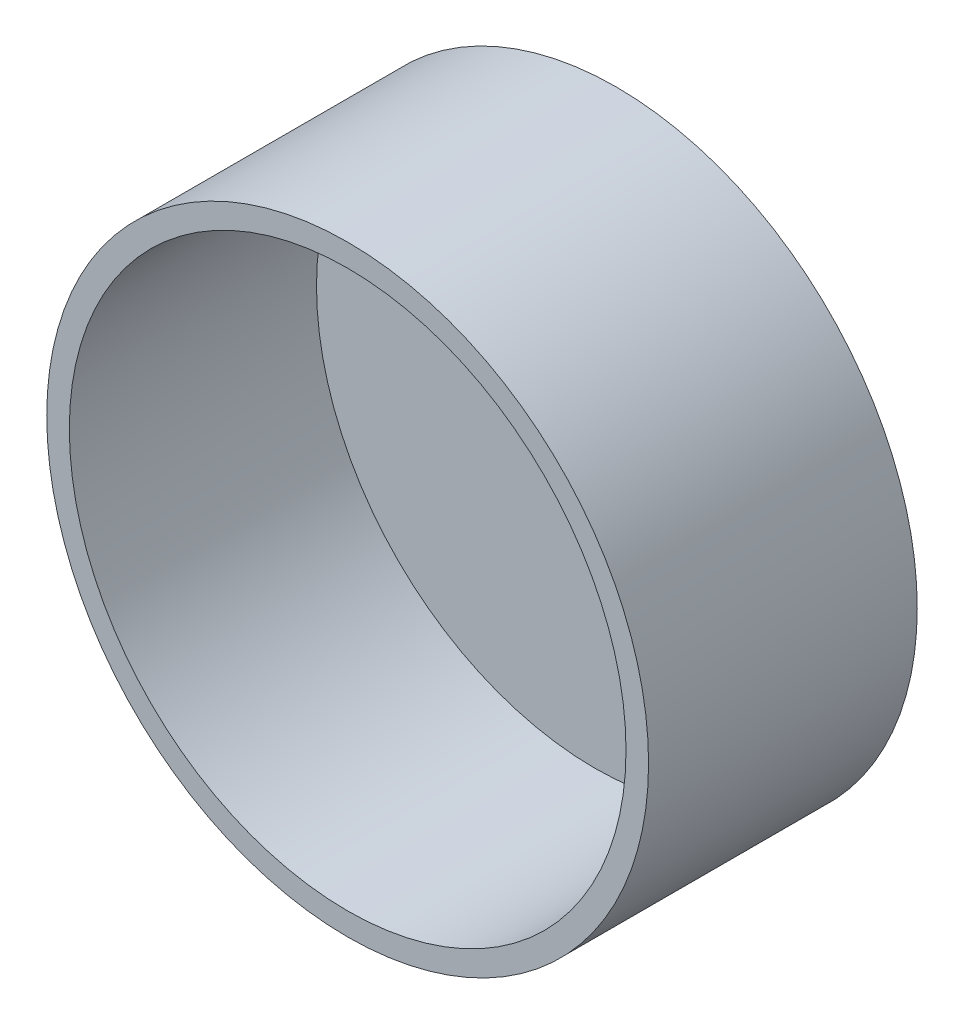
ISO-10303-21;
HEADER;
FILE_DESCRIPTION(('STEP AP214'),'2;1');
FILE_NAME('part.step','',(''),(''),'','','');
FILE_SCHEMA(('AUTOMOTIVE_DESIGN { 1 0 10303 214 1 1 1 1 }'));
ENDSEC;
DATA;
#1=APPLICATION_CONTEXT('core data for automotive mechanical design processes');
#2=APPLICATION_PROTOCOL_DEFINITION('international standard','automotive_design',2000,#1);
#3=PRODUCT_CONTEXT('',#1,'mechanical');
#4=PRODUCT('Part','Part','',(#3));
#5=PRODUCT_RELATED_PRODUCT_CATEGORY('part','',(#4));
#6=PRODUCT_DEFINITION_FORMATION('','',#4);
#7=PRODUCT_DEFINITION_CONTEXT('part definition',#1,'design');
#8=PRODUCT_DEFINITION('design','',#6,#7);
#9=PRODUCT_DEFINITION_SHAPE('','',#8);
#10=(LENGTH_UNIT() NAMED_UNIT(*) SI_UNIT(.MILLI.,.METRE.));
#11=(NAMED_UNIT(*) PLANE_ANGLE_UNIT() SI_UNIT($,.RADIAN.));
#12=(NAMED_UNIT(*) SI_UNIT($,.STERADIAN.) SOLID_ANGLE_UNIT());
#13=UNCERTAINTY_MEASURE_WITH_UNIT(LENGTH_MEASURE(1.E-05),#10,'distance_accuracy_value','');
#14=(GEOMETRIC_REPRESENTATION_CONTEXT(3) GLOBAL_UNCERTAINTY_ASSIGNED_CONTEXT((#13)) GLOBAL_UNIT_ASSIGNED_CONTEXT((#10,
#11,#12)) REPRESENTATION_CONTEXT('',''));
#15=CARTESIAN_POINT('',(0.,0.,0.));
#16=DIRECTION('',(0.,0.,1.));
#17=DIRECTION('',(1.,0.,0.));
#18=AXIS2_PLACEMENT_3D('',#15,#16,#17);
#19=CARTESIAN_POINT('',(0.,0.,1.));
#20=DIRECTION('',(0.,0.,-1.));
#21=DIRECTION('',(-1.,0.,0.));
#22=AXIS2_PLACEMENT_3D('',#19,#20,#21);
#23=CYLINDRICAL_SURFACE('',#22,14.);
#24=CARTESIAN_POINT('',(0.,0.,0.));
#25=DIRECTION('',(0.,0.,1.));
#26=DIRECTION('',(1.,0.,0.));
#27=AXIS2_PLACEMENT_3D('',#24,#25,#26);
#28=CIRCLE('',#27,14.);
#29=CARTESIAN_POINT('',(14.,0.,0.));
#30=VERTEX_POINT('',#29);
#31=EDGE_CURVE('E35',#30,#30,#28,.T.);
#32=ORIENTED_EDGE('',*,*,#31,.T.);
#33=EDGE_LOOP('',(#32));
#34=FACE_BOUND('',#33,.T.);
#35=CARTESIAN_POINT('',(0.,0.,12.5));
#36=DIRECTION('',(0.,0.,1.));
#37=DIRECTION('',(1.,0.,0.));
#38=AXIS2_PLACEMENT_3D('',#35,#36,#37);
#39=CIRCLE('',#38,14.);
#40=CARTESIAN_POINT('',(14.,0.,12.5));
#41=VERTEX_POINT('',#40);
#42=EDGE_CURVE('E39',#41,#41,#39,.T.);
#43=ORIENTED_EDGE('',*,*,#42,.F.);
#44=EDGE_LOOP('',(#43));
#45=FACE_BOUND('',#44,.T.);
#46=ADVANCED_FACE('F29',(#34,#45),#23,.T.);
#47=CARTESIAN_POINT('',(0.,0.,0.));
#48=DIRECTION('',(0.,0.,1.));
#49=DIRECTION('',(1.,0.,0.));
#50=AXIS2_PLACEMENT_3D('',#47,#48,#49);
#51=PLANE('',#50);
#52=ORIENTED_EDGE('',*,*,#31,.F.);
#53=EDGE_LOOP('',(#52));
#54=FACE_BOUND('',#53,.T.);
#55=ADVANCED_FACE('F53',(#54),#51,.F.);
#56=CARTESIAN_POINT('',(0.,0.,12.5));
#57=DIRECTION('',(0.,0.,1.));
#58=DIRECTION('',(1.,0.,0.));
#59=AXIS2_PLACEMENT_3D('',#56,#57,#58);
#60=PLANE('',#59);
#61=ORIENTED_EDGE('',*,*,#42,.T.);
#62=EDGE_LOOP('',(#61));
#63=FACE_BOUND('',#62,.T.);
#64=CARTESIAN_POINT('',(0.,0.,12.5));
#65=DIRECTION('',(0.,0.,1.));
#66=DIRECTION('',(1.,0.,0.));
#67=AXIS2_PLACEMENT_3D('',#64,#65,#66);
#68=CIRCLE('',#67,12.95);
#69=CARTESIAN_POINT('',(12.95,0.,12.5));
#70=VERTEX_POINT('',#69);
#71=EDGE_CURVE('E43',#70,#70,#68,.T.);
#72=ORIENTED_EDGE('',*,*,#71,.F.);
#73=EDGE_LOOP('',(#72));
#74=FACE_BOUND('',#73,.T.);
#75=ADVANCED_FACE('F51',(#63,#74),#60,.T.);
#76=CARTESIAN_POINT('',(0.,0.,12.5));
#77=DIRECTION('',(0.,0.,-1.));
#78=DIRECTION('',(-1.,0.,0.));
#79=AXIS2_PLACEMENT_3D('',#76,#77,#78);
#80=CYLINDRICAL_SURFACE('',#79,12.95);
#81=ORIENTED_EDGE('',*,*,#71,.T.);
#82=EDGE_LOOP('',(#81));
#83=FACE_BOUND('',#82,.T.);
#84=CARTESIAN_POINT('',(0.,0.,1.));
#85=DIRECTION('',(0.,0.,1.));
#86=DIRECTION('',(1.,0.,0.));
#87=AXIS2_PLACEMENT_3D('',#84,#85,#86);
#88=CIRCLE('',#87,12.95);
#89=CARTESIAN_POINT('',(12.95,0.,1.));
#90=VERTEX_POINT('',#89);
#91=EDGE_CURVE('E10',#90,#90,#88,.F.);
#92=ORIENTED_EDGE('',*,*,#91,.T.);
#93=EDGE_LOOP('',(#92));
#94=FACE_BOUND('',#93,.T.);
#95=ADVANCED_FACE('F49',(#83,#94),#80,.F.);
#96=CARTESIAN_POINT('',(0.,0.,1.));
#97=DIRECTION('',(0.,0.,1.));
#98=DIRECTION('',(1.,0.,0.));
#99=AXIS2_PLACEMENT_3D('',#96,#97,#98);
#100=PLANE('',#99);
#101=ORIENTED_EDGE('',*,*,#91,.F.);
#102=EDGE_LOOP('',(#101));
#103=FACE_BOUND('',#102,.T.);
#104=ADVANCED_FACE('F60',(#103),#100,.T.);
#105=CLOSED_SHELL('',(#46,#55,#75,#95,#104));
#106=MANIFOLD_SOLID_BREP('B2',#105);
#107=ADVANCED_BREP_SHAPE_REPRESENTATION('',(#18,#106),#14);
#108=SHAPE_DEFINITION_REPRESENTATION(#9,#107);
ENDSEC;
END-ISO-10303-21;
